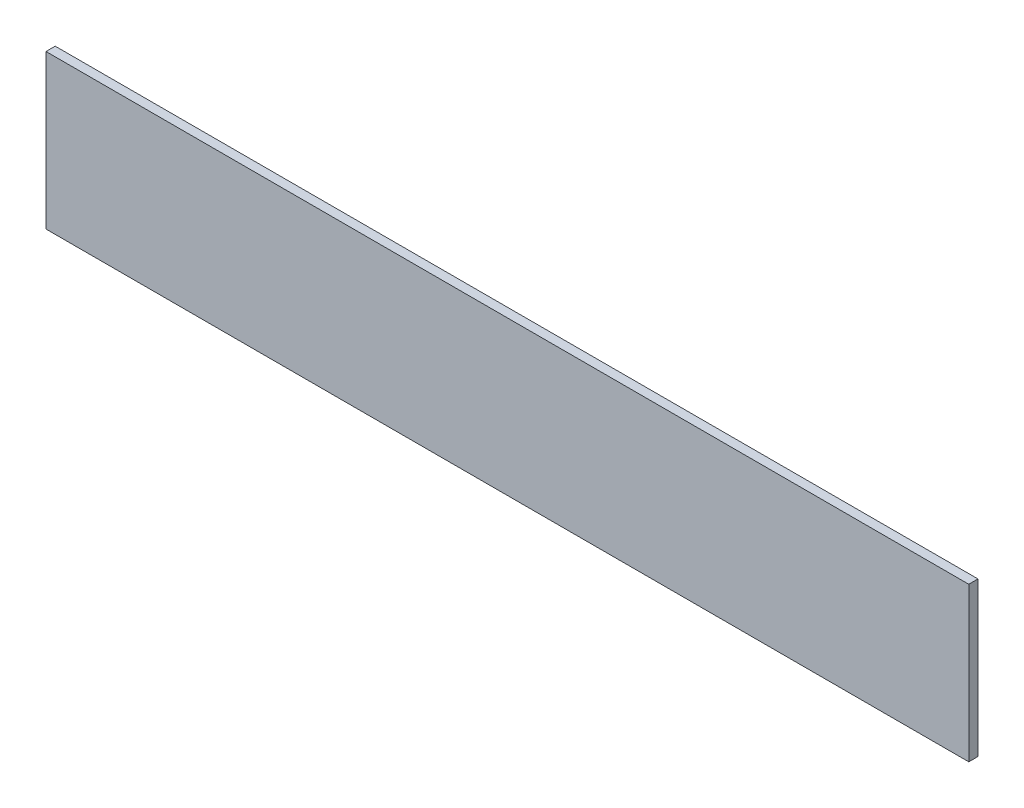
ISO-10303-21;
HEADER;
FILE_DESCRIPTION(('STEP AP214'),'2;1');
FILE_NAME('part.step','',(''),(''),'','','');
FILE_SCHEMA(('AUTOMOTIVE_DESIGN { 1 0 10303 214 1 1 1 1 }'));
ENDSEC;
DATA;
#1=APPLICATION_CONTEXT('core data for automotive mechanical design processes');
#2=APPLICATION_PROTOCOL_DEFINITION('international standard','automotive_design',2000,#1);
#3=PRODUCT_CONTEXT('',#1,'mechanical');
#4=PRODUCT('Part','Part','',(#3));
#5=PRODUCT_RELATED_PRODUCT_CATEGORY('part','',(#4));
#6=PRODUCT_DEFINITION_FORMATION('','',#4);
#7=PRODUCT_DEFINITION_CONTEXT('part definition',#1,'design');
#8=PRODUCT_DEFINITION('design','',#6,#7);
#9=PRODUCT_DEFINITION_SHAPE('','',#8);
#10=(LENGTH_UNIT() NAMED_UNIT(*) SI_UNIT(.MILLI.,.METRE.));
#11=(NAMED_UNIT(*) PLANE_ANGLE_UNIT() SI_UNIT($,.RADIAN.));
#12=(NAMED_UNIT(*) SI_UNIT($,.STERADIAN.) SOLID_ANGLE_UNIT());
#13=UNCERTAINTY_MEASURE_WITH_UNIT(LENGTH_MEASURE(1.E-05),#10,'distance_accuracy_value','');
#14=(GEOMETRIC_REPRESENTATION_CONTEXT(3) GLOBAL_UNCERTAINTY_ASSIGNED_CONTEXT((#13)) GLOBAL_UNIT_ASSIGNED_CONTEXT((#10,
#11,#12)) REPRESENTATION_CONTEXT('',''));
#15=CARTESIAN_POINT('',(0.,0.,0.));
#16=DIRECTION('',(0.,0.,1.));
#17=DIRECTION('',(1.,0.,0.));
#18=AXIS2_PLACEMENT_3D('',#15,#16,#17);
#19=CARTESIAN_POINT('',(-167.03187250996,-13.3964143426295,3.));
#20=DIRECTION('',(0.,1.,0.));
#21=DIRECTION('',(0.,0.,1.));
#22=AXIS2_PLACEMENT_3D('',#19,#20,#21);
#23=PLANE('',#22);
#24=DIRECTION('',(1.,0.,0.));
#25=VECTOR('',#24,1.);
#26=CARTESIAN_POINT('',(-167.03187250996,-13.3964143426295,0.));
#27=LINE('',#26,#25);
#28=CARTESIAN_POINT('',(-167.03187250996,-13.3964143426295,0.));
#29=VERTEX_POINT('',#28);
#30=CARTESIAN_POINT('',(132.96812749004,-13.3964143426295,0.));
#31=VERTEX_POINT('',#30);
#32=EDGE_CURVE('E106',#29,#31,#27,.T.);
#33=ORIENTED_EDGE('',*,*,#32,.T.);
#34=DIRECTION('',(0.,0.,-1.));
#35=VECTOR('',#34,1.);
#36=CARTESIAN_POINT('',(132.96812749004,-13.3964143426295,3.));
#37=LINE('',#36,#35);
#38=CARTESIAN_POINT('',(132.96812749004,-13.3964143426295,3.));
#39=VERTEX_POINT('',#38);
#40=EDGE_CURVE('E11',#39,#31,#37,.T.);
#41=ORIENTED_EDGE('',*,*,#40,.F.);
#42=DIRECTION('',(1.,0.,0.));
#43=VECTOR('',#42,1.);
#44=CARTESIAN_POINT('',(-167.03187250996,-13.3964143426295,3.));
#45=LINE('',#44,#43);
#46=CARTESIAN_POINT('',(-167.03187250996,-13.3964143426295,3.));
#47=VERTEX_POINT('',#46);
#48=EDGE_CURVE('E79',#47,#39,#45,.T.);
#49=ORIENTED_EDGE('',*,*,#48,.F.);
#50=DIRECTION('',(0.,0.,-1.));
#51=VECTOR('',#50,1.);
#52=CARTESIAN_POINT('',(-167.03187250996,-13.3964143426295,3.));
#53=LINE('',#52,#51);
#54=EDGE_CURVE('E102',#47,#29,#53,.T.);
#55=ORIENTED_EDGE('',*,*,#54,.T.);
#56=EDGE_LOOP('',(#33,#41,#49,#55));
#57=FACE_BOUND('',#56,.T.);
#58=ADVANCED_FACE('F39',(#57),#23,.F.);
#59=CARTESIAN_POINT('',(132.96812749004,36.6035856573705,3.));
#60=DIRECTION('',(1.,0.,0.));
#61=DIRECTION('',(0.,0.,-1.));
#62=AXIS2_PLACEMENT_3D('',#59,#60,#61);
#63=PLANE('',#62);
#64=DIRECTION('',(0.,-1.,0.));
#65=VECTOR('',#64,1.);
#66=CARTESIAN_POINT('',(132.96812749004,36.6035856573705,0.));
#67=LINE('',#66,#65);
#68=CARTESIAN_POINT('',(132.96812749004,36.6035856573705,0.));
#69=VERTEX_POINT('',#68);
#70=EDGE_CURVE('E88',#69,#31,#67,.T.);
#71=ORIENTED_EDGE('',*,*,#70,.F.);
#72=DIRECTION('',(0.,0.,-1.));
#73=VECTOR('',#72,1.);
#74=CARTESIAN_POINT('',(132.96812749004,36.6035856573705,3.));
#75=LINE('',#74,#73);
#76=CARTESIAN_POINT('',(132.96812749004,36.6035856573705,3.));
#77=VERTEX_POINT('',#76);
#78=EDGE_CURVE('E48',#77,#69,#75,.T.);
#79=ORIENTED_EDGE('',*,*,#78,.F.);
#80=DIRECTION('',(0.,-1.,0.));
#81=VECTOR('',#80,1.);
#82=CARTESIAN_POINT('',(132.96812749004,36.6035856573705,3.));
#83=LINE('',#82,#81);
#84=EDGE_CURVE('E86',#77,#39,#83,.T.);
#85=ORIENTED_EDGE('',*,*,#84,.T.);
#86=ORIENTED_EDGE('',*,*,#40,.T.);
#87=EDGE_LOOP('',(#71,#79,#85,#86));
#88=FACE_BOUND('',#87,.T.);
#89=ADVANCED_FACE('F85',(#88),#63,.T.);
#90=CARTESIAN_POINT('',(-167.03187250996,36.6035856573705,3.));
#91=DIRECTION('',(0.,1.,0.));
#92=DIRECTION('',(0.,0.,1.));
#93=AXIS2_PLACEMENT_3D('',#90,#91,#92);
#94=PLANE('',#93);
#95=DIRECTION('',(1.,0.,0.));
#96=VECTOR('',#95,1.);
#97=CARTESIAN_POINT('',(-167.03187250996,36.6035856573705,0.));
#98=LINE('',#97,#96);
#99=CARTESIAN_POINT('',(-167.03187250996,36.6035856573705,0.));
#100=VERTEX_POINT('',#99);
#101=EDGE_CURVE('E112',#100,#69,#98,.T.);
#102=ORIENTED_EDGE('',*,*,#101,.F.);
#103=DIRECTION('',(0.,0.,-1.));
#104=VECTOR('',#103,1.);
#105=CARTESIAN_POINT('',(-167.03187250996,36.6035856573705,3.));
#106=LINE('',#105,#104);
#107=CARTESIAN_POINT('',(-167.03187250996,36.6035856573705,3.));
#108=VERTEX_POINT('',#107);
#109=EDGE_CURVE('E71',#108,#100,#106,.T.);
#110=ORIENTED_EDGE('',*,*,#109,.F.);
#111=DIRECTION('',(1.,0.,0.));
#112=VECTOR('',#111,1.);
#113=CARTESIAN_POINT('',(-167.03187250996,36.6035856573705,3.));
#114=LINE('',#113,#112);
#115=EDGE_CURVE('E95',#108,#77,#114,.T.);
#116=ORIENTED_EDGE('',*,*,#115,.T.);
#117=ORIENTED_EDGE('',*,*,#78,.T.);
#118=EDGE_LOOP('',(#102,#110,#116,#117));
#119=FACE_BOUND('',#118,.T.);
#120=ADVANCED_FACE('F98',(#119),#94,.T.);
#121=CARTESIAN_POINT('',(-167.03187250996,36.6035856573705,3.));
#122=DIRECTION('',(1.,0.,0.));
#123=DIRECTION('',(0.,0.,-1.));
#124=AXIS2_PLACEMENT_3D('',#121,#122,#123);
#125=PLANE('',#124);
#126=DIRECTION('',(0.,-1.,0.));
#127=VECTOR('',#126,1.);
#128=CARTESIAN_POINT('',(-167.03187250996,36.6035856573705,0.));
#129=LINE('',#128,#127);
#130=EDGE_CURVE('E74',#100,#29,#129,.T.);
#131=ORIENTED_EDGE('',*,*,#130,.T.);
#132=ORIENTED_EDGE('',*,*,#54,.F.);
#133=DIRECTION('',(0.,-1.,0.));
#134=VECTOR('',#133,1.);
#135=CARTESIAN_POINT('',(-167.03187250996,36.6035856573705,3.));
#136=LINE('',#135,#134);
#137=EDGE_CURVE('E56',#108,#47,#136,.T.);
#138=ORIENTED_EDGE('',*,*,#137,.F.);
#139=ORIENTED_EDGE('',*,*,#109,.T.);
#140=EDGE_LOOP('',(#131,#132,#138,#139));
#141=FACE_BOUND('',#140,.T.);
#142=ADVANCED_FACE('F129',(#141),#125,.F.);
#143=CARTESIAN_POINT('',(0.,0.,3.));
#144=DIRECTION('',(0.,0.,-1.));
#145=DIRECTION('',(-1.,0.,0.));
#146=AXIS2_PLACEMENT_3D('',#143,#144,#145);
#147=PLANE('',#146);
#148=ORIENTED_EDGE('',*,*,#48,.T.);
#149=ORIENTED_EDGE('',*,*,#84,.F.);
#150=ORIENTED_EDGE('',*,*,#115,.F.);
#151=ORIENTED_EDGE('',*,*,#137,.T.);
#152=EDGE_LOOP('',(#148,#149,#150,#151));
#153=FACE_BOUND('',#152,.T.);
#154=ADVANCED_FACE('F94',(#153),#147,.F.);
#155=CARTESIAN_POINT('',(0.,0.,0.));
#156=DIRECTION('',(0.,0.,-1.));
#157=DIRECTION('',(-1.,0.,0.));
#158=AXIS2_PLACEMENT_3D('',#155,#156,#157);
#159=PLANE('',#158);
#160=ORIENTED_EDGE('',*,*,#32,.F.);
#161=ORIENTED_EDGE('',*,*,#130,.F.);
#162=ORIENTED_EDGE('',*,*,#101,.T.);
#163=ORIENTED_EDGE('',*,*,#70,.T.);
#164=EDGE_LOOP('',(#160,#161,#162,#163));
#165=FACE_BOUND('',#164,.T.);
#166=ADVANCED_FACE('F123',(#165),#159,.T.);
#167=CLOSED_SHELL('',(#58,#89,#120,#142,#154,#166));
#168=MANIFOLD_SOLID_BREP('B2',#167);
#169=ADVANCED_BREP_SHAPE_REPRESENTATION('',(#18,#168),#14);
#170=SHAPE_DEFINITION_REPRESENTATION(#9,#169);
ENDSEC;
END-ISO-10303-21;
